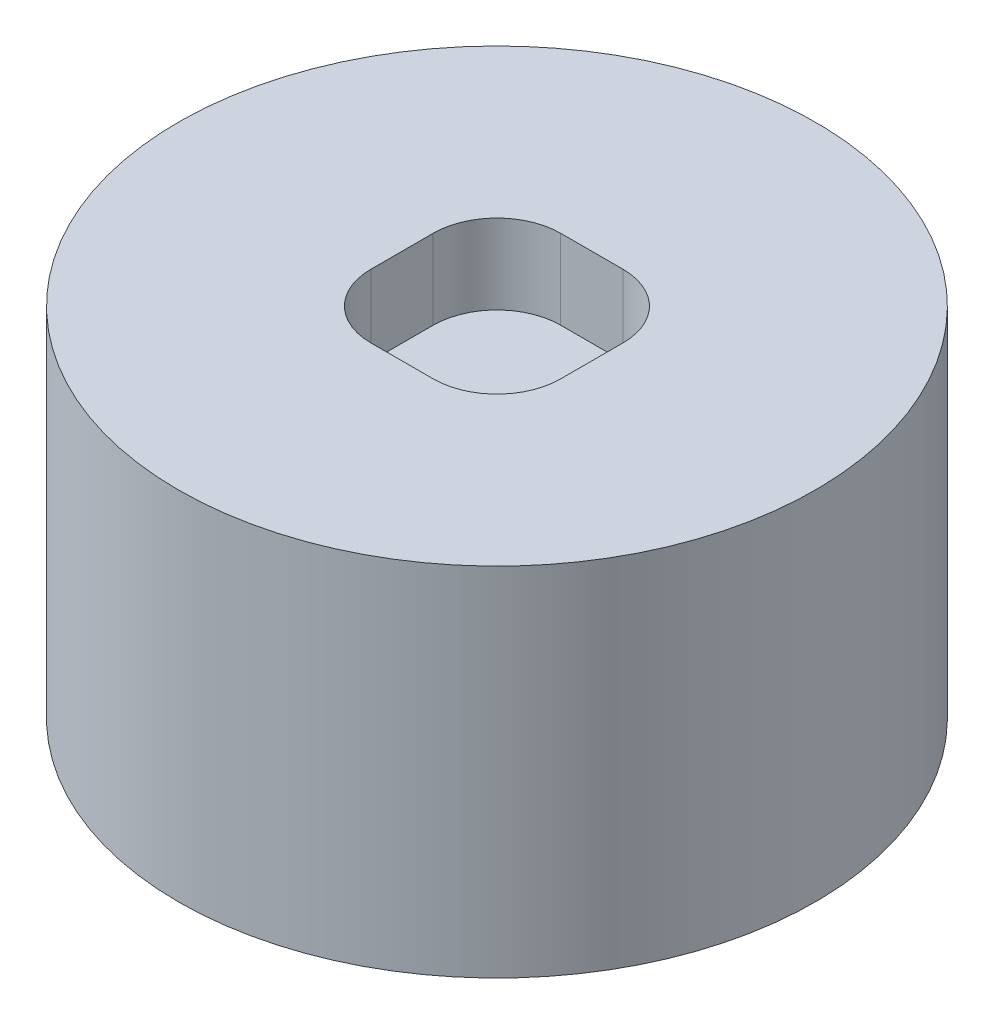
ISO-10303-21;
HEADER;
FILE_DESCRIPTION(('STEP AP214'),'2;1');
FILE_NAME('part.step','',(''),(''),'','','');
FILE_SCHEMA(('AUTOMOTIVE_DESIGN { 1 0 10303 214 1 1 1 1 }'));
ENDSEC;
DATA;
#1=APPLICATION_CONTEXT('core data for automotive mechanical design processes');
#2=APPLICATION_PROTOCOL_DEFINITION('international standard','automotive_design',2000,#1);
#3=PRODUCT_CONTEXT('',#1,'mechanical');
#4=PRODUCT('Part','Part','',(#3));
#5=PRODUCT_RELATED_PRODUCT_CATEGORY('part','',(#4));
#6=PRODUCT_DEFINITION_FORMATION('','',#4);
#7=PRODUCT_DEFINITION_CONTEXT('part definition',#1,'design');
#8=PRODUCT_DEFINITION('design','',#6,#7);
#9=PRODUCT_DEFINITION_SHAPE('','',#8);
#10=(LENGTH_UNIT() NAMED_UNIT(*) SI_UNIT(.MILLI.,.METRE.));
#11=(NAMED_UNIT(*) PLANE_ANGLE_UNIT() SI_UNIT($,.RADIAN.));
#12=(NAMED_UNIT(*) SI_UNIT($,.STERADIAN.) SOLID_ANGLE_UNIT());
#13=UNCERTAINTY_MEASURE_WITH_UNIT(LENGTH_MEASURE(1.E-05),#10,'distance_accuracy_value','');
#14=(GEOMETRIC_REPRESENTATION_CONTEXT(3) GLOBAL_UNCERTAINTY_ASSIGNED_CONTEXT((#13)) GLOBAL_UNIT_ASSIGNED_CONTEXT((#10,
#11,#12)) REPRESENTATION_CONTEXT('',''));
#15=CARTESIAN_POINT('',(0.,0.,0.));
#16=DIRECTION('',(0.,0.,1.));
#17=DIRECTION('',(1.,0.,0.));
#18=AXIS2_PLACEMENT_3D('',#15,#16,#17);
#19=CARTESIAN_POINT('',(0.,0.,0.));
#20=DIRECTION('',(0.,1.,0.));
#21=DIRECTION('',(0.,0.,1.));
#22=AXIS2_PLACEMENT_3D('',#19,#20,#21);
#23=PLANE('',#22);
#24=CARTESIAN_POINT('',(0.,0.,0.));
#25=DIRECTION('',(0.,1.,0.));
#26=DIRECTION('',(0.,0.,1.));
#27=AXIS2_PLACEMENT_3D('',#24,#25,#26);
#28=CIRCLE('',#27,10.);
#29=CARTESIAN_POINT('',(0.,0.,10.));
#30=VERTEX_POINT('',#29);
#31=EDGE_CURVE('E11',#30,#30,#28,.T.);
#32=ORIENTED_EDGE('',*,*,#31,.F.);
#33=EDGE_LOOP('',(#32));
#34=FACE_BOUND('',#33,.T.);
#35=CARTESIAN_POINT('',(0.,0.,0.));
#36=DIRECTION('',(0.,1.,0.));
#37=DIRECTION('',(0.,0.,1.));
#38=AXIS2_PLACEMENT_3D('',#35,#36,#37);
#39=CIRCLE('',#38,8.985);
#40=CARTESIAN_POINT('',(0.,0.,8.985));
#41=VERTEX_POINT('',#40);
#42=EDGE_CURVE('E56',#41,#41,#39,.T.);
#43=ORIENTED_EDGE('',*,*,#42,.T.);
#44=EDGE_LOOP('',(#43));
#45=FACE_BOUND('',#44,.T.);
#46=ADVANCED_FACE('F47',(#34,#45),#23,.F.);
#47=CARTESIAN_POINT('',(0.,0.7,0.));
#48=DIRECTION('',(0.,-1.,0.));
#49=DIRECTION('',(0.,0.,-1.));
#50=AXIS2_PLACEMENT_3D('',#47,#48,#49);
#51=CYLINDRICAL_SURFACE('',#50,10.);
#52=ORIENTED_EDGE('',*,*,#31,.T.);
#53=EDGE_LOOP('',(#52));
#54=FACE_BOUND('',#53,.T.);
#55=CARTESIAN_POINT('',(0.,11.2,0.));
#56=DIRECTION('',(0.,1.,0.));
#57=DIRECTION('',(0.,0.,1.));
#58=AXIS2_PLACEMENT_3D('',#55,#56,#57);
#59=CIRCLE('',#58,10.);
#60=CARTESIAN_POINT('',(0.,11.2,10.));
#61=VERTEX_POINT('',#60);
#62=EDGE_CURVE('E129',#61,#61,#59,.T.);
#63=ORIENTED_EDGE('',*,*,#62,.F.);
#64=EDGE_LOOP('',(#63));
#65=FACE_BOUND('',#64,.T.);
#66=ADVANCED_FACE('F49',(#54,#65),#51,.T.);
#67=CARTESIAN_POINT('',(0.,0.7,0.));
#68=DIRECTION('',(0.,-1.,0.));
#69=DIRECTION('',(0.,0.,-1.));
#70=AXIS2_PLACEMENT_3D('',#67,#68,#69);
#71=CYLINDRICAL_SURFACE('',#70,8.985);
#72=CARTESIAN_POINT('',(0.,0.7,0.));
#73=DIRECTION('',(0.,1.,0.));
#74=DIRECTION('',(0.,0.,1.));
#75=AXIS2_PLACEMENT_3D('',#72,#73,#74);
#76=CIRCLE('',#75,8.985);
#77=CARTESIAN_POINT('',(0.,0.7,8.985));
#78=VERTEX_POINT('',#77);
#79=EDGE_CURVE('E213',#78,#78,#76,.T.);
#80=ORIENTED_EDGE('',*,*,#79,.T.);
#81=EDGE_LOOP('',(#80));
#82=FACE_BOUND('',#81,.T.);
#83=ORIENTED_EDGE('',*,*,#42,.F.);
#84=EDGE_LOOP('',(#83));
#85=FACE_BOUND('',#84,.T.);
#86=ADVANCED_FACE('F221',(#82,#85),#71,.F.);
#87=CARTESIAN_POINT('',(0.,0.7,0.));
#88=DIRECTION('',(0.,1.,0.));
#89=DIRECTION('',(0.,0.,1.));
#90=AXIS2_PLACEMENT_3D('',#87,#88,#89);
#91=PLANE('',#90);
#92=CARTESIAN_POINT('',(0.,0.7,0.));
#93=DIRECTION('',(0.,1.,0.));
#94=DIRECTION('',(0.,0.,1.));
#95=AXIS2_PLACEMENT_3D('',#92,#93,#94);
#96=CIRCLE('',#95,6.);
#97=CARTESIAN_POINT('',(0.,0.7,6.));
#98=VERTEX_POINT('',#97);
#99=EDGE_CURVE('E209',#98,#98,#96,.T.);
#100=ORIENTED_EDGE('',*,*,#99,.T.);
#101=EDGE_LOOP('',(#100));
#102=FACE_BOUND('',#101,.T.);
#103=ORIENTED_EDGE('',*,*,#79,.F.);
#104=EDGE_LOOP('',(#103));
#105=FACE_BOUND('',#104,.T.);
#106=ADVANCED_FACE('F223',(#102,#105),#91,.F.);
#107=CARTESIAN_POINT('',(0.,7.7,0.));
#108=DIRECTION('',(0.,-1.,0.));
#109=DIRECTION('',(0.,0.,-1.));
#110=AXIS2_PLACEMENT_3D('',#107,#108,#109);
#111=CYLINDRICAL_SURFACE('',#110,6.);
#112=CARTESIAN_POINT('',(0.,7.7,0.));
#113=DIRECTION('',(0.,1.,0.));
#114=DIRECTION('',(0.,0.,1.));
#115=AXIS2_PLACEMENT_3D('',#112,#113,#114);
#116=CIRCLE('',#115,6.);
#117=CARTESIAN_POINT('',(0.,7.7,6.));
#118=VERTEX_POINT('',#117);
#119=EDGE_CURVE('E205',#118,#118,#116,.T.);
#120=ORIENTED_EDGE('',*,*,#119,.T.);
#121=EDGE_LOOP('',(#120));
#122=FACE_BOUND('',#121,.T.);
#123=ORIENTED_EDGE('',*,*,#99,.F.);
#124=EDGE_LOOP('',(#123));
#125=FACE_BOUND('',#124,.T.);
#126=ADVANCED_FACE('F230',(#122,#125),#111,.F.);
#127=CARTESIAN_POINT('',(0.,7.7,0.));
#128=DIRECTION('',(0.,1.,0.));
#129=DIRECTION('',(0.,0.,1.));
#130=AXIS2_PLACEMENT_3D('',#127,#128,#129);
#131=PLANE('',#130);
#132=ORIENTED_EDGE('',*,*,#119,.F.);
#133=EDGE_LOOP('',(#132));
#134=FACE_BOUND('',#133,.T.);
#135=ADVANCED_FACE('F243',(#134),#131,.F.);
#136=CARTESIAN_POINT('',(0.,11.2,0.));
#137=DIRECTION('',(0.,1.,0.));
#138=DIRECTION('',(0.,0.,1.));
#139=AXIS2_PLACEMENT_3D('',#136,#137,#138);
#140=PLANE('',#139);
#141=ORIENTED_EDGE('',*,*,#62,.T.);
#142=EDGE_LOOP('',(#141));
#143=FACE_BOUND('',#142,.T.);
#144=DIRECTION('',(1.,0.,0.));
#145=VECTOR('',#144,1.);
#146=CARTESIAN_POINT('',(-0.979999999999985,11.2,2.98));
#147=LINE('',#146,#145);
#148=CARTESIAN_POINT('',(-0.979999999999985,11.2,2.98));
#149=VERTEX_POINT('',#148);
#150=CARTESIAN_POINT('',(0.979999999999987,11.2,2.98));
#151=VERTEX_POINT('',#150);
#152=EDGE_CURVE('E122',#149,#151,#147,.T.);
#153=ORIENTED_EDGE('',*,*,#152,.F.);
#154=CARTESIAN_POINT('',(-0.98,11.2,0.98));
#155=DIRECTION('',(0.,1.,0.));
#156=DIRECTION('',(0.,0.,1.));
#157=AXIS2_PLACEMENT_3D('',#154,#155,#156);
#158=CIRCLE('',#157,2.);
#159=CARTESIAN_POINT('',(-2.98,11.2,0.979999999999986));
#160=VERTEX_POINT('',#159);
#161=EDGE_CURVE('E112',#160,#149,#158,.T.);
#162=ORIENTED_EDGE('',*,*,#161,.F.);
#163=DIRECTION('',(0.,0.,1.));
#164=VECTOR('',#163,1.);
#165=CARTESIAN_POINT('',(-2.98,11.2,-0.979999999999986));
#166=LINE('',#165,#164);
#167=CARTESIAN_POINT('',(-2.98,11.2,-0.979999999999986));
#168=VERTEX_POINT('',#167);
#169=EDGE_CURVE('E154',#168,#160,#166,.T.);
#170=ORIENTED_EDGE('',*,*,#169,.F.);
#171=CARTESIAN_POINT('',(-0.98,11.2,-0.98));
#172=DIRECTION('',(0.,1.,0.));
#173=DIRECTION('',(0.,0.,1.));
#174=AXIS2_PLACEMENT_3D('',#171,#172,#173);
#175=CIRCLE('',#174,2.);
#176=CARTESIAN_POINT('',(-0.979999999999986,11.2,-2.98));
#177=VERTEX_POINT('',#176);
#178=EDGE_CURVE('E150',#177,#168,#175,.T.);
#179=ORIENTED_EDGE('',*,*,#178,.F.);
#180=DIRECTION('',(-1.,0.,0.));
#181=VECTOR('',#180,1.);
#182=CARTESIAN_POINT('',(-0.979999999999986,11.2,-2.98));
#183=LINE('',#182,#181);
#184=CARTESIAN_POINT('',(0.979999999999986,11.2,-2.98));
#185=VERTEX_POINT('',#184);
#186=EDGE_CURVE('E147',#185,#177,#183,.T.);
#187=ORIENTED_EDGE('',*,*,#186,.F.);
#188=CARTESIAN_POINT('',(0.98,11.2,-0.98));
#189=DIRECTION('',(0.,1.,0.));
#190=DIRECTION('',(0.,0.,-1.));
#191=AXIS2_PLACEMENT_3D('',#188,#189,#190);
#192=CIRCLE('',#191,2.);
#193=CARTESIAN_POINT('',(2.98,11.2,-0.979999999999986));
#194=VERTEX_POINT('',#193);
#195=EDGE_CURVE('E144',#194,#185,#192,.T.);
#196=ORIENTED_EDGE('',*,*,#195,.F.);
#197=DIRECTION('',(0.,0.,-1.));
#198=VECTOR('',#197,1.);
#199=CARTESIAN_POINT('',(2.98,11.2,-0.979999999999986));
#200=LINE('',#199,#198);
#201=CARTESIAN_POINT('',(2.98,11.2,0.979999999999986));
#202=VERTEX_POINT('',#201);
#203=EDGE_CURVE('E139',#202,#194,#200,.T.);
#204=ORIENTED_EDGE('',*,*,#203,.F.);
#205=CARTESIAN_POINT('',(0.980000000000001,11.2,0.98));
#206=DIRECTION('',(0.,1.,0.));
#207=DIRECTION('',(0.,0.,1.));
#208=AXIS2_PLACEMENT_3D('',#205,#206,#207);
#209=CIRCLE('',#208,2.);
#210=EDGE_CURVE('E135',#151,#202,#209,.T.);
#211=ORIENTED_EDGE('',*,*,#210,.F.);
#212=EDGE_LOOP('',(#153,#162,#170,#179,#187,#196,#204,#211));
#213=FACE_BOUND('',#212,.T.);
#214=ADVANCED_FACE('F133',(#143,#213),#140,.T.);
#215=CARTESIAN_POINT('',(-0.98,11.2,0.98));
#216=DIRECTION('',(0.,-1.,0.));
#217=DIRECTION('',(0.,0.,-1.));
#218=AXIS2_PLACEMENT_3D('',#215,#216,#217);
#219=CYLINDRICAL_SURFACE('',#218,2.);
#220=CARTESIAN_POINT('',(-0.98,8.7,0.98));
#221=DIRECTION('',(0.,1.,0.));
#222=DIRECTION('',(0.,0.,1.));
#223=AXIS2_PLACEMENT_3D('',#220,#221,#222);
#224=CIRCLE('',#223,2.);
#225=CARTESIAN_POINT('',(-2.98,8.7,0.979999999999986));
#226=VERTEX_POINT('',#225);
#227=CARTESIAN_POINT('',(-0.979999999999985,8.7,2.98));
#228=VERTEX_POINT('',#227);
#229=EDGE_CURVE('E63',#226,#228,#224,.T.);
#230=ORIENTED_EDGE('',*,*,#229,.F.);
#231=DIRECTION('',(0.,-1.,0.));
#232=VECTOR('',#231,1.);
#233=CARTESIAN_POINT('',(-2.98,11.2,0.979999999999986));
#234=LINE('',#233,#232);
#235=EDGE_CURVE('E117',#160,#226,#234,.T.);
#236=ORIENTED_EDGE('',*,*,#235,.F.);
#237=ORIENTED_EDGE('',*,*,#161,.T.);
#238=DIRECTION('',(0.,-1.,0.));
#239=VECTOR('',#238,1.);
#240=CARTESIAN_POINT('',(-0.979999999999985,11.2,2.98));
#241=LINE('',#240,#239);
#242=EDGE_CURVE('E115',#149,#228,#241,.T.);
#243=ORIENTED_EDGE('',*,*,#242,.T.);
#244=EDGE_LOOP('',(#230,#236,#237,#243));
#245=FACE_BOUND('',#244,.T.);
#246=ADVANCED_FACE('F114',(#245),#219,.F.);
#247=CARTESIAN_POINT('',(-0.979999999999985,11.2,2.98));
#248=DIRECTION('',(0.,0.,-1.));
#249=DIRECTION('',(-1.,0.,0.));
#250=AXIS2_PLACEMENT_3D('',#247,#248,#249);
#251=PLANE('',#250);
#252=DIRECTION('',(1.,0.,0.));
#253=VECTOR('',#252,1.);
#254=CARTESIAN_POINT('',(-0.979999999999985,8.7,2.98));
#255=LINE('',#254,#253);
#256=CARTESIAN_POINT('',(0.980000000000001,8.7,2.98));
#257=VERTEX_POINT('',#256);
#258=EDGE_CURVE('E67',#228,#257,#255,.T.);
#259=ORIENTED_EDGE('',*,*,#258,.F.);
#260=ORIENTED_EDGE('',*,*,#242,.F.);
#261=ORIENTED_EDGE('',*,*,#152,.T.);
#262=DIRECTION('',(0.,-1.,0.));
#263=VECTOR('',#262,1.);
#264=CARTESIAN_POINT('',(0.979999999999987,11.2,2.98));
#265=LINE('',#264,#263);
#266=EDGE_CURVE('E130',#151,#257,#265,.T.);
#267=ORIENTED_EDGE('',*,*,#266,.T.);
#268=EDGE_LOOP('',(#259,#260,#261,#267));
#269=FACE_BOUND('',#268,.T.);
#270=ADVANCED_FACE('F126',(#269),#251,.T.);
#271=CARTESIAN_POINT('',(0.980000000000001,11.2,0.98));
#272=DIRECTION('',(0.,-1.,0.));
#273=DIRECTION('',(0.,0.,-1.));
#274=AXIS2_PLACEMENT_3D('',#271,#272,#273);
#275=CYLINDRICAL_SURFACE('',#274,2.);
#276=CARTESIAN_POINT('',(0.980000000000001,8.7,0.98));
#277=DIRECTION('',(0.,1.,0.));
#278=DIRECTION('',(0.,0.,1.));
#279=AXIS2_PLACEMENT_3D('',#276,#277,#278);
#280=CIRCLE('',#279,2.);
#281=CARTESIAN_POINT('',(2.98,8.7,0.979999999999986));
#282=VERTEX_POINT('',#281);
#283=EDGE_CURVE('E161',#257,#282,#280,.T.);
#284=ORIENTED_EDGE('',*,*,#283,.F.);
#285=ORIENTED_EDGE('',*,*,#266,.F.);
#286=ORIENTED_EDGE('',*,*,#210,.T.);
#287=DIRECTION('',(0.,-1.,0.));
#288=VECTOR('',#287,1.);
#289=CARTESIAN_POINT('',(2.98,11.2,0.979999999999986));
#290=LINE('',#289,#288);
#291=EDGE_CURVE('E196',#202,#282,#290,.T.);
#292=ORIENTED_EDGE('',*,*,#291,.T.);
#293=EDGE_LOOP('',(#284,#285,#286,#292));
#294=FACE_BOUND('',#293,.T.);
#295=ADVANCED_FACE('F305',(#294),#275,.F.);
#296=CARTESIAN_POINT('',(2.98,11.2,-0.979999999999986));
#297=DIRECTION('',(-1.,0.,0.));
#298=DIRECTION('',(0.,0.,1.));
#299=AXIS2_PLACEMENT_3D('',#296,#297,#298);
#300=PLANE('',#299);
#301=DIRECTION('',(0.,0.,-1.));
#302=VECTOR('',#301,1.);
#303=CARTESIAN_POINT('',(2.98,8.7,-0.979999999999986));
#304=LINE('',#303,#302);
#305=CARTESIAN_POINT('',(2.98,8.7,-0.979999999999986));
#306=VERTEX_POINT('',#305);
#307=EDGE_CURVE('E164',#282,#306,#304,.T.);
#308=ORIENTED_EDGE('',*,*,#307,.F.);
#309=ORIENTED_EDGE('',*,*,#291,.F.);
#310=ORIENTED_EDGE('',*,*,#203,.T.);
#311=DIRECTION('',(0.,-1.,0.));
#312=VECTOR('',#311,1.);
#313=CARTESIAN_POINT('',(2.98,11.2,-0.979999999999986));
#314=LINE('',#313,#312);
#315=EDGE_CURVE('E192',#194,#306,#314,.T.);
#316=ORIENTED_EDGE('',*,*,#315,.T.);
#317=EDGE_LOOP('',(#308,#309,#310,#316));
#318=FACE_BOUND('',#317,.T.);
#319=ADVANCED_FACE('F313',(#318),#300,.T.);
#320=CARTESIAN_POINT('',(0.98,11.2,-0.98));
#321=DIRECTION('',(0.,-1.,0.));
#322=DIRECTION('',(0.,0.,-1.));
#323=AXIS2_PLACEMENT_3D('',#320,#321,#322);
#324=CYLINDRICAL_SURFACE('',#323,2.);
#325=CARTESIAN_POINT('',(0.98,8.7,-0.98));
#326=DIRECTION('',(0.,1.,0.));
#327=DIRECTION('',(0.,0.,-1.));
#328=AXIS2_PLACEMENT_3D('',#325,#326,#327);
#329=CIRCLE('',#328,2.);
#330=CARTESIAN_POINT('',(0.979999999999986,8.7,-2.98));
#331=VERTEX_POINT('',#330);
#332=EDGE_CURVE('E167',#306,#331,#329,.T.);
#333=ORIENTED_EDGE('',*,*,#332,.F.);
#334=ORIENTED_EDGE('',*,*,#315,.F.);
#335=ORIENTED_EDGE('',*,*,#195,.T.);
#336=DIRECTION('',(0.,-1.,0.));
#337=VECTOR('',#336,1.);
#338=CARTESIAN_POINT('',(0.979999999999986,11.2,-2.98));
#339=LINE('',#338,#337);
#340=EDGE_CURVE('E188',#185,#331,#339,.T.);
#341=ORIENTED_EDGE('',*,*,#340,.T.);
#342=EDGE_LOOP('',(#333,#334,#335,#341));
#343=FACE_BOUND('',#342,.T.);
#344=ADVANCED_FACE('F323',(#343),#324,.F.);
#345=CARTESIAN_POINT('',(-0.979999999999986,11.2,-2.98));
#346=DIRECTION('',(0.,0.,1.));
#347=DIRECTION('',(1.,0.,0.));
#348=AXIS2_PLACEMENT_3D('',#345,#346,#347);
#349=PLANE('',#348);
#350=DIRECTION('',(-1.,0.,0.));
#351=VECTOR('',#350,1.);
#352=CARTESIAN_POINT('',(-0.979999999999986,8.7,-2.98));
#353=LINE('',#352,#351);
#354=CARTESIAN_POINT('',(-0.979999999999986,8.7,-2.98));
#355=VERTEX_POINT('',#354);
#356=EDGE_CURVE('E170',#331,#355,#353,.T.);
#357=ORIENTED_EDGE('',*,*,#356,.F.);
#358=ORIENTED_EDGE('',*,*,#340,.F.);
#359=ORIENTED_EDGE('',*,*,#186,.T.);
#360=DIRECTION('',(0.,-1.,0.));
#361=VECTOR('',#360,1.);
#362=CARTESIAN_POINT('',(-0.979999999999986,11.2,-2.98));
#363=LINE('',#362,#361);
#364=EDGE_CURVE('E184',#177,#355,#363,.T.);
#365=ORIENTED_EDGE('',*,*,#364,.T.);
#366=EDGE_LOOP('',(#357,#358,#359,#365));
#367=FACE_BOUND('',#366,.T.);
#368=ADVANCED_FACE('F333',(#367),#349,.T.);
#369=CARTESIAN_POINT('',(-0.98,11.2,-0.98));
#370=DIRECTION('',(0.,-1.,0.));
#371=DIRECTION('',(0.,0.,-1.));
#372=AXIS2_PLACEMENT_3D('',#369,#370,#371);
#373=CYLINDRICAL_SURFACE('',#372,2.);
#374=CARTESIAN_POINT('',(-0.98,8.7,-0.98));
#375=DIRECTION('',(0.,1.,0.));
#376=DIRECTION('',(0.,0.,1.));
#377=AXIS2_PLACEMENT_3D('',#374,#375,#376);
#378=CIRCLE('',#377,2.);
#379=CARTESIAN_POINT('',(-2.98,8.7,-0.979999999999986));
#380=VERTEX_POINT('',#379);
#381=EDGE_CURVE('E173',#355,#380,#378,.T.);
#382=ORIENTED_EDGE('',*,*,#381,.F.);
#383=ORIENTED_EDGE('',*,*,#364,.F.);
#384=ORIENTED_EDGE('',*,*,#178,.T.);
#385=DIRECTION('',(0.,-1.,0.));
#386=VECTOR('',#385,1.);
#387=CARTESIAN_POINT('',(-2.98,11.2,-0.979999999999986));
#388=LINE('',#387,#386);
#389=EDGE_CURVE('E180',#168,#380,#388,.T.);
#390=ORIENTED_EDGE('',*,*,#389,.T.);
#391=EDGE_LOOP('',(#382,#383,#384,#390));
#392=FACE_BOUND('',#391,.T.);
#393=ADVANCED_FACE('F343',(#392),#373,.F.);
#394=CARTESIAN_POINT('',(-2.98,11.2,-0.979999999999986));
#395=DIRECTION('',(1.,0.,0.));
#396=DIRECTION('',(0.,0.,-1.));
#397=AXIS2_PLACEMENT_3D('',#394,#395,#396);
#398=PLANE('',#397);
#399=DIRECTION('',(0.,0.,1.));
#400=VECTOR('',#399,1.);
#401=CARTESIAN_POINT('',(-2.98,8.7,-0.979999999999986));
#402=LINE('',#401,#400);
#403=EDGE_CURVE('E123',#380,#226,#402,.T.);
#404=ORIENTED_EDGE('',*,*,#403,.F.);
#405=ORIENTED_EDGE('',*,*,#389,.F.);
#406=ORIENTED_EDGE('',*,*,#169,.T.);
#407=ORIENTED_EDGE('',*,*,#235,.T.);
#408=EDGE_LOOP('',(#404,#405,#406,#407));
#409=FACE_BOUND('',#408,.T.);
#410=ADVANCED_FACE('F256',(#409),#398,.T.);
#411=CARTESIAN_POINT('',(0.,8.7,0.));
#412=DIRECTION('',(0.,1.,0.));
#413=DIRECTION('',(0.,0.,1.));
#414=AXIS2_PLACEMENT_3D('',#411,#412,#413);
#415=PLANE('',#414);
#416=ORIENTED_EDGE('',*,*,#229,.T.);
#417=ORIENTED_EDGE('',*,*,#258,.T.);
#418=ORIENTED_EDGE('',*,*,#283,.T.);
#419=ORIENTED_EDGE('',*,*,#307,.T.);
#420=ORIENTED_EDGE('',*,*,#332,.T.);
#421=ORIENTED_EDGE('',*,*,#356,.T.);
#422=ORIENTED_EDGE('',*,*,#381,.T.);
#423=ORIENTED_EDGE('',*,*,#403,.T.);
#424=EDGE_LOOP('',(#416,#417,#418,#419,#420,#421,#422,#423));
#425=FACE_BOUND('',#424,.T.);
#426=ADVANCED_FACE('F254',(#425),#415,.T.);
#427=CLOSED_SHELL('',(#46,#66,#86,#106,#126,#135,#214,#246,#270,#295,#319,#344,#368,#393,#410,#426));
#428=MANIFOLD_SOLID_BREP('B2',#427);
#429=ADVANCED_BREP_SHAPE_REPRESENTATION('',(#18,#428),#14);
#430=SHAPE_DEFINITION_REPRESENTATION(#9,#429);
ENDSEC;
END-ISO-10303-21;
